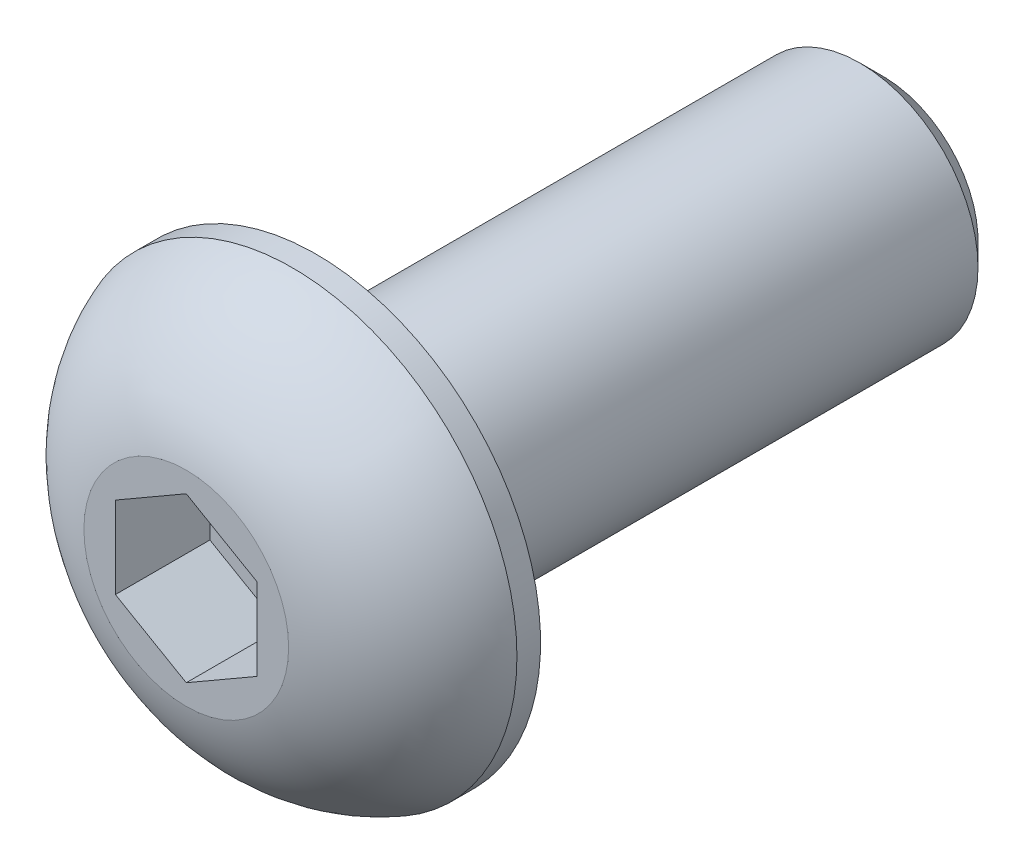
ISO-10303-21;
HEADER;
FILE_DESCRIPTION(('STEP AP214'),'2;1');
FILE_NAME('part.step','',(''),(''),'','','');
FILE_SCHEMA(('AUTOMOTIVE_DESIGN { 1 0 10303 214 1 1 1 1 }'));
ENDSEC;
DATA;
#1=APPLICATION_CONTEXT('core data for automotive mechanical design processes');
#2=APPLICATION_PROTOCOL_DEFINITION('international standard','automotive_design',2000,#1);
#3=PRODUCT_CONTEXT('',#1,'mechanical');
#4=PRODUCT('Part','Part','',(#3));
#5=PRODUCT_RELATED_PRODUCT_CATEGORY('part','',(#4));
#6=PRODUCT_DEFINITION_FORMATION('','',#4);
#7=PRODUCT_DEFINITION_CONTEXT('part definition',#1,'design');
#8=PRODUCT_DEFINITION('design','',#6,#7);
#9=PRODUCT_DEFINITION_SHAPE('','',#8);
#10=(LENGTH_UNIT() NAMED_UNIT(*) SI_UNIT(.MILLI.,.METRE.));
#11=(NAMED_UNIT(*) PLANE_ANGLE_UNIT() SI_UNIT($,.RADIAN.));
#12=(NAMED_UNIT(*) SI_UNIT($,.STERADIAN.) SOLID_ANGLE_UNIT());
#13=UNCERTAINTY_MEASURE_WITH_UNIT(LENGTH_MEASURE(1.E-05),#10,'distance_accuracy_value','');
#14=(GEOMETRIC_REPRESENTATION_CONTEXT(3) GLOBAL_UNCERTAINTY_ASSIGNED_CONTEXT((#13)) GLOBAL_UNIT_ASSIGNED_CONTEXT((#10,
#11,#12)) REPRESENTATION_CONTEXT('',''));
#15=CARTESIAN_POINT('',(0.,0.,0.));
#16=DIRECTION('',(0.,0.,1.));
#17=DIRECTION('',(1.,0.,0.));
#18=AXIS2_PLACEMENT_3D('',#15,#16,#17);
#19=CARTESIAN_POINT('',(0.,2.8466118351389E-13,-0.200000000000198));
#20=DIRECTION('',(0.,0.,-1.));
#21=DIRECTION('',(0.,-1.,0.));
#22=AXIS2_PLACEMENT_3D('',#19,#20,#21);
#23=TOROIDAL_SURFACE('',#22,2.69999999999971,0.199999999999989);
#24=CARTESIAN_POINT('',(0.,2.8466118351389E-13,0.));
#25=DIRECTION('',(0.,0.,1.));
#26=DIRECTION('',(-1.,0.,0.));
#27=AXIS2_PLACEMENT_3D('',#24,#25,#26);
#28=CIRCLE('',#27,2.69999999999971);
#29=CARTESIAN_POINT('',(2.7,0.,0.));
#30=VERTEX_POINT('',#29);
#31=EDGE_CURVE('E19',#30,#30,#28,.T.);
#32=ORIENTED_EDGE('',*,*,#31,.F.);
#33=EDGE_LOOP('',(#32));
#34=FACE_BOUND('',#33,.T.);
#35=CARTESIAN_POINT('',(0.,2.8466118351389E-13,-0.200000000000198));
#36=DIRECTION('',(0.,0.,-1.));
#37=DIRECTION('',(-1.,0.,0.));
#38=AXIS2_PLACEMENT_3D('',#35,#36,#37);
#39=CIRCLE('',#38,2.5);
#40=CARTESIAN_POINT('',(2.5,0.,-0.2));
#41=VERTEX_POINT('',#40);
#42=EDGE_CURVE('E26',#41,#41,#39,.T.);
#43=ORIENTED_EDGE('',*,*,#42,.F.);
#44=EDGE_LOOP('',(#43));
#45=FACE_BOUND('',#44,.T.);
#46=ADVANCED_FACE('F15',(#34,#45),#23,.F.);
#47=CARTESIAN_POINT('',(0.,1.18571819029967E-13,-0.71052389580011));
#48=DIRECTION('',(0.,0.,-1.));
#49=DIRECTION('',(0.,1.,0.));
#50=AXIS2_PLACEMENT_3D('',#47,#48,#49);
#51=DEGENERATE_TOROIDAL_SURFACE('',#50,1.42411293070011,3.539335093,.T.);
#52=CARTESIAN_POINT('',(0.,1.18571819029967E-13,0.500000000207385));
#53=DIRECTION('',(0.,0.,-1.));
#54=DIRECTION('',(-1.,0.,0.));
#55=AXIS2_PLACEMENT_3D('',#52,#53,#54);
#56=CIRCLE('',#55,4.75);
#57=CARTESIAN_POINT('',(4.75,0.,0.500000000207385));
#58=VERTEX_POINT('',#57);
#59=EDGE_CURVE('E188',#58,#58,#56,.T.);
#60=ORIENTED_EDGE('',*,*,#59,.F.);
#61=EDGE_LOOP('',(#60));
#62=FACE_BOUND('',#61,.T.);
#63=CARTESIAN_POINT('',(0.,1.18571820451762E-13,2.75000000000453));
#64=DIRECTION('',(0.,0.,-1.));
#65=DIRECTION('',(1.,0.,0.));
#66=AXIS2_PLACEMENT_3D('',#63,#64,#65);
#67=CIRCLE('',#66,2.16685600007635);
#68=CARTESIAN_POINT('',(2.16685600046491,0.,2.74999999992121));
#69=VERTEX_POINT('',#68);
#70=EDGE_CURVE('E9',#69,#69,#67,.T.);
#71=ORIENTED_EDGE('',*,*,#70,.T.);
#72=EDGE_LOOP('',(#71));
#73=FACE_BOUND('',#72,.T.);
#74=ADVANCED_FACE('F375',(#62,#73),#51,.T.);
#75=CARTESIAN_POINT('',(0.,0.,-5.854625));
#76=DIRECTION('',(0.,0.,-1.));
#77=DIRECTION('',(-1.,0.,0.));
#78=AXIS2_PLACEMENT_3D('',#75,#76,#77);
#79=CYLINDRICAL_SURFACE('',#78,2.5);
#80=ORIENTED_EDGE('',*,*,#42,.T.);
#81=EDGE_LOOP('',(#80));
#82=FACE_BOUND('',#81,.T.);
#83=CARTESIAN_POINT('',(0.,0.,-11.5092499999582));
#84=DIRECTION('',(0.,0.,1.));
#85=DIRECTION('',(-1.,0.,0.));
#86=AXIS2_PLACEMENT_3D('',#83,#84,#85);
#87=CIRCLE('',#86,2.5);
#88=CARTESIAN_POINT('',(-2.5,0.,-11.5092499999582));
#89=VERTEX_POINT('',#88);
#90=EDGE_CURVE('E68',#89,#89,#87,.T.);
#91=ORIENTED_EDGE('',*,*,#90,.T.);
#92=EDGE_LOOP('',(#91));
#93=FACE_BOUND('',#92,.T.);
#94=ADVANCED_FACE('F357',(#82,#93),#79,.T.);
#95=CARTESIAN_POINT('',(0.,0.,-11.5092500000742));
#96=DIRECTION('',(0.,0.,1.));
#97=DIRECTION('',(1.,0.,0.));
#98=AXIS2_PLACEMENT_3D('',#95,#96,#97);
#99=CONICAL_SURFACE('',#98,2.49999999988404,0.785398163339534);
#100=CARTESIAN_POINT('',(0.,0.,-12.));
#101=DIRECTION('',(0.,0.,1.));
#102=DIRECTION('',(1.,0.,0.));
#103=AXIS2_PLACEMENT_3D('',#100,#101,#102);
#104=CIRCLE('',#103,2.00925000001507);
#105=CARTESIAN_POINT('',(-2.00925000001462,0.,-12.0000000000005));
#106=VERTEX_POINT('',#105);
#107=EDGE_CURVE('E78',#106,#106,#104,.T.);
#108=ORIENTED_EDGE('',*,*,#107,.T.);
#109=EDGE_LOOP('',(#108));
#110=FACE_BOUND('',#109,.T.);
#111=ORIENTED_EDGE('',*,*,#90,.F.);
#112=EDGE_LOOP('',(#111));
#113=FACE_BOUND('',#112,.T.);
#114=ADVANCED_FACE('F352',(#110,#113),#99,.T.);
#115=CARTESIAN_POINT('',(0.,0.,0.25));
#116=DIRECTION('',(0.,0.,-1.));
#117=DIRECTION('',(-1.,0.,0.));
#118=AXIS2_PLACEMENT_3D('',#115,#116,#117);
#119=CYLINDRICAL_SURFACE('',#118,4.75);
#120=ORIENTED_EDGE('',*,*,#59,.T.);
#121=EDGE_LOOP('',(#120));
#122=FACE_BOUND('',#121,.T.);
#123=CARTESIAN_POINT('',(0.,0.,0.));
#124=DIRECTION('',(0.,0.,-1.));
#125=DIRECTION('',(-1.,0.,0.));
#126=AXIS2_PLACEMENT_3D('',#123,#124,#125);
#127=CIRCLE('',#126,4.75);
#128=CARTESIAN_POINT('',(-4.75,0.,0.));
#129=VERTEX_POINT('',#128);
#130=EDGE_CURVE('E184',#129,#129,#127,.T.);
#131=ORIENTED_EDGE('',*,*,#130,.F.);
#132=EDGE_LOOP('',(#131));
#133=FACE_BOUND('',#132,.T.);
#134=ADVANCED_FACE('F356',(#122,#133),#119,.T.);
#135=CARTESIAN_POINT('',(-1.004625,0.,-12.));
#136=DIRECTION('',(0.,0.,-1.));
#137=DIRECTION('',(0.,-1.,0.));
#138=AXIS2_PLACEMENT_3D('',#135,#136,#137);
#139=PLANE('',#138);
#140=ORIENTED_EDGE('',*,*,#107,.F.);
#141=EDGE_LOOP('',(#140));
#142=FACE_BOUND('',#141,.T.);
#143=ADVANCED_FACE('F366',(#142),#139,.T.);
#144=CARTESIAN_POINT('',(-3.725,0.,0.));
#145=DIRECTION('',(0.,0.,-1.));
#146=DIRECTION('',(0.,-1.,0.));
#147=AXIS2_PLACEMENT_3D('',#144,#145,#146);
#148=PLANE('',#147);
#149=ORIENTED_EDGE('',*,*,#130,.T.);
#150=EDGE_LOOP('',(#149));
#151=FACE_BOUND('',#150,.T.);
#152=ORIENTED_EDGE('',*,*,#31,.T.);
#153=EDGE_LOOP('',(#152));
#154=FACE_BOUND('',#153,.T.);
#155=ADVANCED_FACE('F362',(#151,#154),#148,.T.);
#156=CARTESIAN_POINT('',(-1.94342800002782,0.,2.75000000000453));
#157=DIRECTION('',(0.,0.,1.));
#158=DIRECTION('',(1.,-2.02697144560536E-11,0.));
#159=AXIS2_PLACEMENT_3D('',#156,#157,#158);
#160=PLANE('',#159);
#161=ORIENTED_EDGE('',*,*,#70,.F.);
#162=EDGE_LOOP('',(#161));
#163=FACE_BOUND('',#162,.T.);
#164=DIRECTION('',(0.866025403780548,0.500000000006738,0.));
#165=VECTOR('',#164,1.);
#166=CARTESIAN_POINT('',(-1.47878550001399,0.878273601077865,2.75000000000453));
#167=LINE('',#166,#165);
#168=CARTESIAN_POINT('',(-1.5,0.8660254038,2.75000000000453));
#169=VERTEX_POINT('',#168);
#170=CARTESIAN_POINT('',(0.,1.7320508076,2.75000000000453));
#171=VERTEX_POINT('',#170);
#172=EDGE_CURVE('E169',#169,#171,#167,.T.);
#173=ORIENTED_EDGE('',*,*,#172,.T.);
#174=DIRECTION('',(0.866025403780548,-0.500000000006738,0.));
#175=VECTOR('',#174,1.);
#176=CARTESIAN_POINT('',(0.0212145000062227,1.71980261031047,2.75000000000453));
#177=LINE('',#176,#175);
#178=CARTESIAN_POINT('',(1.5,0.8660254038,2.75000000000453));
#179=VERTEX_POINT('',#178);
#180=EDGE_CURVE('E173',#171,#179,#177,.T.);
#181=ORIENTED_EDGE('',*,*,#180,.T.);
#182=DIRECTION('',(0.,-1.,0.));
#183=VECTOR('',#182,1.);
#184=CARTESIAN_POINT('',(1.5,0.21650635095,2.75000000000453));
#185=LINE('',#184,#183);
#186=CARTESIAN_POINT('',(1.5,-0.8660254038,2.75000000000453));
#187=VERTEX_POINT('',#186);
#188=EDGE_CURVE('E138',#179,#187,#185,.T.);
#189=ORIENTED_EDGE('',*,*,#188,.T.);
#190=DIRECTION('',(-0.866025403780548,-0.500000000006738,0.));
#191=VECTOR('',#190,1.);
#192=CARTESIAN_POINT('',(0.0212145000062227,-1.71980261031047,2.75000000000453));
#193=LINE('',#192,#191);
#194=CARTESIAN_POINT('',(0.,-1.7320508076,2.75000000000453));
#195=VERTEX_POINT('',#194);
#196=EDGE_CURVE('E176',#187,#195,#193,.T.);
#197=ORIENTED_EDGE('',*,*,#196,.T.);
#198=DIRECTION('',(-0.866025403780548,0.500000000006738,0.));
#199=VECTOR('',#198,1.);
#200=CARTESIAN_POINT('',(-1.47878550001399,-0.878273601077865,2.75000000000453));
#201=LINE('',#200,#199);
#202=CARTESIAN_POINT('',(-1.5,-0.8660254038,2.75000000000453));
#203=VERTEX_POINT('',#202);
#204=EDGE_CURVE('E180',#195,#203,#201,.T.);
#205=ORIENTED_EDGE('',*,*,#204,.T.);
#206=DIRECTION('',(0.,1.,0.));
#207=VECTOR('',#206,1.);
#208=CARTESIAN_POINT('',(-1.5,0.,2.75000000000453));
#209=LINE('',#208,#207);
#210=EDGE_CURVE('E150',#203,#169,#209,.T.);
#211=ORIENTED_EDGE('',*,*,#210,.T.);
#212=EDGE_LOOP('',(#173,#181,#189,#197,#205,#211));
#213=FACE_BOUND('',#212,.T.);
#214=ADVANCED_FACE('F238',(#163,#213),#160,.T.);
#215=CARTESIAN_POINT('',(0.75,1.2990381057,2.75));
#216=DIRECTION('',(0.500000000006738,0.866025403780548,0.));
#217=DIRECTION('',(0.,0.,-1.));
#218=AXIS2_PLACEMENT_3D('',#215,#216,#217);
#219=PLANE('',#218);
#220=DIRECTION('',(0.,0.,-1.));
#221=VECTOR('',#220,1.);
#222=CARTESIAN_POINT('',(1.5,0.8660254038,2.75));
#223=LINE('',#222,#221);
#224=CARTESIAN_POINT('',(1.5,0.8660254038,0.75));
#225=VERTEX_POINT('',#224);
#226=EDGE_CURVE('E134',#179,#225,#223,.T.);
#227=ORIENTED_EDGE('',*,*,#226,.F.);
#228=ORIENTED_EDGE('',*,*,#180,.F.);
#229=DIRECTION('',(0.,0.,1.));
#230=VECTOR('',#229,1.);
#231=CARTESIAN_POINT('',(0.,1.7320508076,2.75));
#232=LINE('',#231,#230);
#233=CARTESIAN_POINT('',(0.,1.7320508076,0.75));
#234=VERTEX_POINT('',#233);
#235=EDGE_CURVE('E146',#234,#171,#232,.T.);
#236=ORIENTED_EDGE('',*,*,#235,.F.);
#237=DIRECTION('',(-0.866025403780548,0.500000000006738,0.));
#238=VECTOR('',#237,1.);
#239=CARTESIAN_POINT('',(0.750000000010108,1.29903810569416,0.75));
#240=LINE('',#239,#238);
#241=EDGE_CURVE('E143',#225,#234,#240,.T.);
#242=ORIENTED_EDGE('',*,*,#241,.F.);
#243=EDGE_LOOP('',(#227,#228,#236,#242));
#244=FACE_BOUND('',#243,.T.);
#245=ADVANCED_FACE('F144',(#244),#219,.F.);
#246=CARTESIAN_POINT('',(0.,0.,0.75));
#247=DIRECTION('',(0.,0.,-1.));
#248=DIRECTION('',(0.,-1.,0.));
#249=AXIS2_PLACEMENT_3D('',#246,#247,#248);
#250=PLANE('',#249);
#251=ORIENTED_EDGE('',*,*,#241,.T.);
#252=DIRECTION('',(0.866025403780548,0.500000000006738,0.));
#253=VECTOR('',#252,1.);
#254=CARTESIAN_POINT('',(-0.750000000010108,1.29903810569416,0.75));
#255=LINE('',#254,#253);
#256=CARTESIAN_POINT('',(-1.5,0.8660254038,0.75));
#257=VERTEX_POINT('',#256);
#258=EDGE_CURVE('E160',#257,#234,#255,.T.);
#259=ORIENTED_EDGE('',*,*,#258,.F.);
#260=DIRECTION('',(0.,-1.,0.));
#261=VECTOR('',#260,1.);
#262=CARTESIAN_POINT('',(-1.5,0.,0.75));
#263=LINE('',#262,#261);
#264=CARTESIAN_POINT('',(-1.5,-0.8660254038,0.75));
#265=VERTEX_POINT('',#264);
#266=EDGE_CURVE('E151',#257,#265,#263,.T.);
#267=ORIENTED_EDGE('',*,*,#266,.T.);
#268=DIRECTION('',(0.866025403780548,-0.500000000006738,0.));
#269=VECTOR('',#268,1.);
#270=CARTESIAN_POINT('',(-0.750000000010108,-1.29903810569416,0.75));
#271=LINE('',#270,#269);
#272=CARTESIAN_POINT('',(0.,-1.7320508076,0.75));
#273=VERTEX_POINT('',#272);
#274=EDGE_CURVE('E203',#265,#273,#271,.T.);
#275=ORIENTED_EDGE('',*,*,#274,.T.);
#276=DIRECTION('',(0.866025403780548,0.500000000006738,0.));
#277=VECTOR('',#276,1.);
#278=CARTESIAN_POINT('',(0.750000000010108,-1.29903810569416,0.75));
#279=LINE('',#278,#277);
#280=CARTESIAN_POINT('',(1.5,-0.8660254038,0.75));
#281=VERTEX_POINT('',#280);
#282=EDGE_CURVE('E119',#273,#281,#279,.T.);
#283=ORIENTED_EDGE('',*,*,#282,.T.);
#284=DIRECTION('',(0.,-1.,0.));
#285=VECTOR('',#284,1.);
#286=CARTESIAN_POINT('',(1.5,0.21650635095,0.75));
#287=LINE('',#286,#285);
#288=EDGE_CURVE('E109',#225,#281,#287,.T.);
#289=ORIENTED_EDGE('',*,*,#288,.F.);
#290=EDGE_LOOP('',(#251,#259,#267,#275,#283,#289));
#291=FACE_BOUND('',#290,.T.);
#292=ADVANCED_FACE('F153',(#291),#250,.F.);
#293=CARTESIAN_POINT('',(1.5,0.4330127019,2.75));
#294=DIRECTION('',(1.,0.,0.));
#295=DIRECTION('',(0.,1.,0.));
#296=AXIS2_PLACEMENT_3D('',#293,#294,#295);
#297=PLANE('',#296);
#298=DIRECTION('',(0.,0.,-1.));
#299=VECTOR('',#298,1.);
#300=CARTESIAN_POINT('',(1.5,-0.8660254038,2.75));
#301=LINE('',#300,#299);
#302=EDGE_CURVE('E220',#187,#281,#301,.T.);
#303=ORIENTED_EDGE('',*,*,#302,.F.);
#304=ORIENTED_EDGE('',*,*,#188,.F.);
#305=ORIENTED_EDGE('',*,*,#226,.T.);
#306=ORIENTED_EDGE('',*,*,#288,.T.);
#307=EDGE_LOOP('',(#303,#304,#305,#306));
#308=FACE_BOUND('',#307,.T.);
#309=ADVANCED_FACE('F136',(#308),#297,.F.);
#310=CARTESIAN_POINT('',(-0.75,1.2990381057,2.75));
#311=DIRECTION('',(-0.500000000006738,0.866025403780548,0.));
#312=DIRECTION('',(0.,0.,1.));
#313=AXIS2_PLACEMENT_3D('',#310,#311,#312);
#314=PLANE('',#313);
#315=ORIENTED_EDGE('',*,*,#235,.T.);
#316=ORIENTED_EDGE('',*,*,#172,.F.);
#317=DIRECTION('',(0.,0.,1.));
#318=VECTOR('',#317,1.);
#319=CARTESIAN_POINT('',(-1.5,0.8660254038,2.75));
#320=LINE('',#319,#318);
#321=EDGE_CURVE('E167',#257,#169,#320,.T.);
#322=ORIENTED_EDGE('',*,*,#321,.F.);
#323=ORIENTED_EDGE('',*,*,#258,.T.);
#324=EDGE_LOOP('',(#315,#316,#322,#323));
#325=FACE_BOUND('',#324,.T.);
#326=ADVANCED_FACE('F243',(#325),#314,.F.);
#327=CARTESIAN_POINT('',(0.75,-1.2990381057,2.75));
#328=DIRECTION('',(0.500000000006738,-0.866025403780548,0.));
#329=DIRECTION('',(0.,0.,-1.));
#330=AXIS2_PLACEMENT_3D('',#327,#328,#329);
#331=PLANE('',#330);
#332=DIRECTION('',(0.,0.,-1.));
#333=VECTOR('',#332,1.);
#334=CARTESIAN_POINT('',(0.,-1.7320508076,2.75));
#335=LINE('',#334,#333);
#336=EDGE_CURVE('E168',#195,#273,#335,.T.);
#337=ORIENTED_EDGE('',*,*,#336,.F.);
#338=ORIENTED_EDGE('',*,*,#196,.F.);
#339=ORIENTED_EDGE('',*,*,#302,.T.);
#340=ORIENTED_EDGE('',*,*,#282,.F.);
#341=EDGE_LOOP('',(#337,#338,#339,#340));
#342=FACE_BOUND('',#341,.T.);
#343=ADVANCED_FACE('F17',(#342),#331,.F.);
#344=CARTESIAN_POINT('',(-1.5,0.,2.75));
#345=DIRECTION('',(-1.,0.,0.));
#346=DIRECTION('',(0.,0.,1.));
#347=AXIS2_PLACEMENT_3D('',#344,#345,#346);
#348=PLANE('',#347);
#349=ORIENTED_EDGE('',*,*,#321,.T.);
#350=ORIENTED_EDGE('',*,*,#210,.F.);
#351=DIRECTION('',(0.,0.,1.));
#352=VECTOR('',#351,1.);
#353=CARTESIAN_POINT('',(-1.5,-0.8660254038,2.75));
#354=LINE('',#353,#352);
#355=EDGE_CURVE('E164',#265,#203,#354,.T.);
#356=ORIENTED_EDGE('',*,*,#355,.F.);
#357=ORIENTED_EDGE('',*,*,#266,.F.);
#358=EDGE_LOOP('',(#349,#350,#356,#357));
#359=FACE_BOUND('',#358,.T.);
#360=ADVANCED_FACE('F244',(#359),#348,.F.);
#361=CARTESIAN_POINT('',(-0.75,-1.2990381057,2.75));
#362=DIRECTION('',(-0.500000000006738,-0.866025403780548,0.));
#363=DIRECTION('',(-0.866025403780548,0.500000000006738,0.));
#364=AXIS2_PLACEMENT_3D('',#361,#362,#363);
#365=PLANE('',#364);
#366=ORIENTED_EDGE('',*,*,#355,.T.);
#367=ORIENTED_EDGE('',*,*,#204,.F.);
#368=ORIENTED_EDGE('',*,*,#336,.T.);
#369=ORIENTED_EDGE('',*,*,#274,.F.);
#370=EDGE_LOOP('',(#366,#367,#368,#369));
#371=FACE_BOUND('',#370,.T.);
#372=ADVANCED_FACE('F246',(#371),#365,.F.);
#373=CLOSED_SHELL('',(#46,#74,#94,#114,#134,#143,#155,#214,#245,#292,#309,#326,#343,#360,#372));
#374=MANIFOLD_SOLID_BREP('B1',#373);
#375=ADVANCED_BREP_SHAPE_REPRESENTATION('',(#18,#374),#14);
#376=SHAPE_DEFINITION_REPRESENTATION(#9,#375);
ENDSEC;
END-ISO-10303-21;
